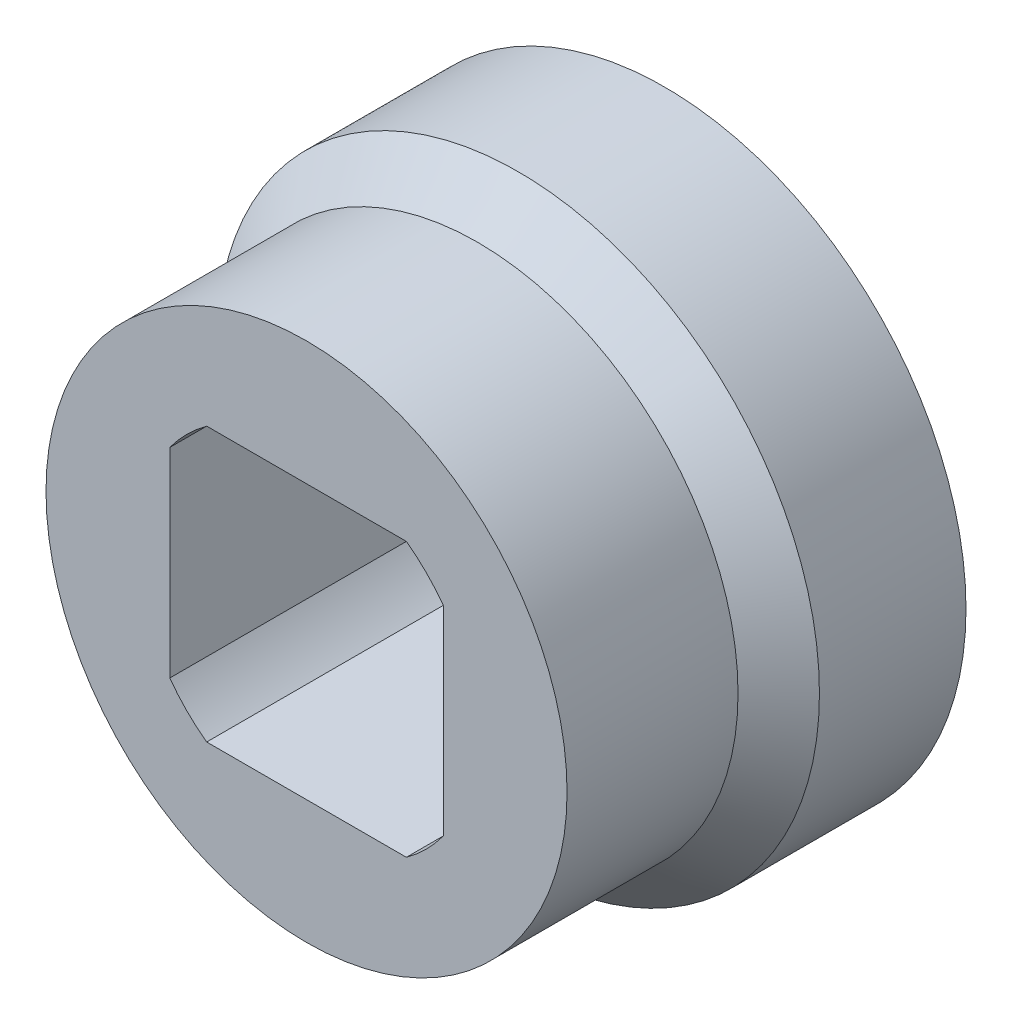
ISO-10303-21;
HEADER;
FILE_DESCRIPTION(('STEP AP214'),'2;1');
FILE_NAME('part.step','',(''),(''),'','','');
FILE_SCHEMA(('AUTOMOTIVE_DESIGN { 1 0 10303 214 1 1 1 1 }'));
ENDSEC;
DATA;
#1=APPLICATION_CONTEXT('core data for automotive mechanical design processes');
#2=APPLICATION_PROTOCOL_DEFINITION('international standard','automotive_design',2000,#1);
#3=PRODUCT_CONTEXT('',#1,'mechanical');
#4=PRODUCT('Part','Part','',(#3));
#5=PRODUCT_RELATED_PRODUCT_CATEGORY('part','',(#4));
#6=PRODUCT_DEFINITION_FORMATION('','',#4);
#7=PRODUCT_DEFINITION_CONTEXT('part definition',#1,'design');
#8=PRODUCT_DEFINITION('design','',#6,#7);
#9=PRODUCT_DEFINITION_SHAPE('','',#8);
#10=(LENGTH_UNIT() NAMED_UNIT(*) SI_UNIT(.MILLI.,.METRE.));
#11=(NAMED_UNIT(*) PLANE_ANGLE_UNIT() SI_UNIT($,.RADIAN.));
#12=(NAMED_UNIT(*) SI_UNIT($,.STERADIAN.) SOLID_ANGLE_UNIT());
#13=UNCERTAINTY_MEASURE_WITH_UNIT(LENGTH_MEASURE(1.E-05),#10,'distance_accuracy_value','');
#14=(GEOMETRIC_REPRESENTATION_CONTEXT(3) GLOBAL_UNCERTAINTY_ASSIGNED_CONTEXT((#13)) GLOBAL_UNIT_ASSIGNED_CONTEXT((#10,
#11,#12)) REPRESENTATION_CONTEXT('',''));
#15=CARTESIAN_POINT('',(0.,0.,0.));
#16=DIRECTION('',(0.,0.,1.));
#17=DIRECTION('',(1.,0.,0.));
#18=AXIS2_PLACEMENT_3D('',#15,#16,#17);
#19=CARTESIAN_POINT('',(0.,0.,-3.5));
#20=DIRECTION('',(0.,0.,-1.));
#21=DIRECTION('',(-1.,0.,0.));
#22=AXIS2_PLACEMENT_3D('',#19,#20,#21);
#23=CYLINDRICAL_SURFACE('',#22,15.9999999999999);
#24=CARTESIAN_POINT('',(0.,0.,-3.5));
#25=DIRECTION('',(0.,0.,-1.));
#26=DIRECTION('',(-1.,0.,0.));
#27=AXIS2_PLACEMENT_3D('',#24,#25,#26);
#28=CIRCLE('',#27,15.9999999999999);
#29=CARTESIAN_POINT('',(-15.9999999999999,0.,-3.5));
#30=VERTEX_POINT('',#29);
#31=EDGE_CURVE('E43',#30,#30,#28,.T.);
#32=ORIENTED_EDGE('',*,*,#31,.T.);
#33=EDGE_LOOP('',(#32));
#34=FACE_BOUND('',#33,.T.);
#35=CARTESIAN_POINT('',(0.,0.,-14.));
#36=DIRECTION('',(0.,0.,-1.));
#37=DIRECTION('',(-1.,0.,0.));
#38=AXIS2_PLACEMENT_3D('',#35,#36,#37);
#39=CIRCLE('',#38,15.9999999999999);
#40=CARTESIAN_POINT('',(-15.9999999999999,0.,-14.));
#41=VERTEX_POINT('',#40);
#42=EDGE_CURVE('E127',#41,#41,#39,.T.);
#43=ORIENTED_EDGE('',*,*,#42,.F.);
#44=EDGE_LOOP('',(#43));
#45=FACE_BOUND('',#44,.T.);
#46=ADVANCED_FACE('F36',(#34,#45),#23,.T.);
#47=CARTESIAN_POINT('',(16.,0.,-3.5));
#48=DIRECTION('',(0.,0.,1.));
#49=DIRECTION('',(1.,0.,0.));
#50=AXIS2_PLACEMENT_3D('',#47,#48,#49);
#51=PLANE('',#50);
#52=CARTESIAN_POINT('',(0.,0.,-3.5));
#53=DIRECTION('',(0.,0.,-1.));
#54=DIRECTION('',(-1.,0.,0.));
#55=AXIS2_PLACEMENT_3D('',#52,#53,#54);
#56=CIRCLE('',#55,10.4);
#57=CARTESIAN_POINT('',(-6.13188388670236,-8.4,-3.5));
#58=VERTEX_POINT('',#57);
#59=CARTESIAN_POINT('',(-8.4,-6.13188388670236,-3.5));
#60=VERTEX_POINT('',#59);
#61=EDGE_CURVE('E110',#58,#60,#56,.T.);
#62=ORIENTED_EDGE('',*,*,#61,.T.);
#63=DIRECTION('',(0.,1.,0.));
#64=VECTOR('',#63,1.);
#65=CARTESIAN_POINT('',(-8.4,-6.13188388670236,-3.5));
#66=LINE('',#65,#64);
#67=CARTESIAN_POINT('',(-8.4,6.13188388670236,-3.5));
#68=VERTEX_POINT('',#67);
#69=EDGE_CURVE('E115',#60,#68,#66,.T.);
#70=ORIENTED_EDGE('',*,*,#69,.T.);
#71=CARTESIAN_POINT('',(0.,0.,-3.5));
#72=DIRECTION('',(0.,0.,-1.));
#73=DIRECTION('',(-1.,0.,0.));
#74=AXIS2_PLACEMENT_3D('',#71,#72,#73);
#75=CIRCLE('',#74,10.4);
#76=CARTESIAN_POINT('',(-6.13188388670235,8.4,-3.5));
#77=VERTEX_POINT('',#76);
#78=EDGE_CURVE('E57',#68,#77,#75,.T.);
#79=ORIENTED_EDGE('',*,*,#78,.T.);
#80=DIRECTION('',(1.,0.,0.));
#81=VECTOR('',#80,1.);
#82=CARTESIAN_POINT('',(-6.13188388670235,8.4,-3.5));
#83=LINE('',#82,#81);
#84=CARTESIAN_POINT('',(6.13188388670236,8.4,-3.5));
#85=VERTEX_POINT('',#84);
#86=EDGE_CURVE('E277',#77,#85,#83,.T.);
#87=ORIENTED_EDGE('',*,*,#86,.T.);
#88=CARTESIAN_POINT('',(0.,0.,-3.5));
#89=DIRECTION('',(0.,0.,-1.));
#90=DIRECTION('',(-1.,0.,0.));
#91=AXIS2_PLACEMENT_3D('',#88,#89,#90);
#92=CIRCLE('',#91,10.4);
#93=CARTESIAN_POINT('',(8.4,6.13188388670235,-3.5));
#94=VERTEX_POINT('',#93);
#95=EDGE_CURVE('E280',#85,#94,#92,.T.);
#96=ORIENTED_EDGE('',*,*,#95,.T.);
#97=DIRECTION('',(0.,-1.,0.));
#98=VECTOR('',#97,1.);
#99=CARTESIAN_POINT('',(8.4,6.13188388670235,-3.5));
#100=LINE('',#99,#98);
#101=CARTESIAN_POINT('',(8.4,-6.13188388670236,-3.5));
#102=VERTEX_POINT('',#101);
#103=EDGE_CURVE('E283',#94,#102,#100,.T.);
#104=ORIENTED_EDGE('',*,*,#103,.T.);
#105=CARTESIAN_POINT('',(0.,0.,-3.5));
#106=DIRECTION('',(0.,0.,-1.));
#107=DIRECTION('',(-1.,0.,0.));
#108=AXIS2_PLACEMENT_3D('',#105,#106,#107);
#109=CIRCLE('',#108,10.4);
#110=CARTESIAN_POINT('',(6.13188388670236,-8.4,-3.5));
#111=VERTEX_POINT('',#110);
#112=EDGE_CURVE('E123',#102,#111,#109,.T.);
#113=ORIENTED_EDGE('',*,*,#112,.T.);
#114=DIRECTION('',(-1.,0.,0.));
#115=VECTOR('',#114,1.);
#116=CARTESIAN_POINT('',(6.13188388670236,-8.4,-3.5));
#117=LINE('',#116,#115);
#118=EDGE_CURVE('E118',#111,#58,#117,.T.);
#119=ORIENTED_EDGE('',*,*,#118,.T.);
#120=EDGE_LOOP('',(#62,#70,#79,#87,#96,#104,#113,#119));
#121=FACE_BOUND('',#120,.T.);
#122=ORIENTED_EDGE('',*,*,#31,.F.);
#123=EDGE_LOOP('',(#122));
#124=FACE_BOUND('',#123,.T.);
#125=ADVANCED_FACE('F140',(#121,#124),#51,.T.);
#126=CARTESIAN_POINT('',(0.,0.,-25.5));
#127=DIRECTION('',(0.,0.,-1.));
#128=DIRECTION('',(-1.,0.,0.));
#129=AXIS2_PLACEMENT_3D('',#126,#127,#128);
#130=PLANE('',#129);
#131=CARTESIAN_POINT('',(0.,0.,-25.5));
#132=DIRECTION('',(0.,0.,1.));
#133=DIRECTION('',(1.,0.,0.));
#134=AXIS2_PLACEMENT_3D('',#131,#132,#133);
#135=CIRCLE('',#134,16.3);
#136=CARTESIAN_POINT('',(16.3000000000001,0.,-25.5));
#137=VERTEX_POINT('',#136);
#138=EDGE_CURVE('E257',#137,#137,#135,.T.);
#139=ORIENTED_EDGE('',*,*,#138,.T.);
#140=EDGE_LOOP('',(#139));
#141=FACE_BOUND('',#140,.T.);
#142=CARTESIAN_POINT('',(0.,0.,-25.5));
#143=DIRECTION('',(0.,0.,-1.));
#144=DIRECTION('',(-1.,0.,0.));
#145=AXIS2_PLACEMENT_3D('',#142,#143,#144);
#146=CIRCLE('',#145,18.5);
#147=CARTESIAN_POINT('',(-18.4999999999999,0.,-25.5));
#148=VERTEX_POINT('',#147);
#149=EDGE_CURVE('E133',#148,#148,#146,.T.);
#150=ORIENTED_EDGE('',*,*,#149,.T.);
#151=EDGE_LOOP('',(#150));
#152=FACE_BOUND('',#151,.T.);
#153=ADVANCED_FACE('F142',(#141,#152),#130,.T.);
#154=CARTESIAN_POINT('',(0.,0.,-3.5));
#155=DIRECTION('',(0.,0.,-1.));
#156=DIRECTION('',(-1.,0.,0.));
#157=AXIS2_PLACEMENT_3D('',#154,#155,#156);
#158=CYLINDRICAL_SURFACE('',#157,18.5);
#159=CARTESIAN_POINT('',(0.,0.,-16.5));
#160=DIRECTION('',(0.,0.,-1.));
#161=DIRECTION('',(-1.,0.,0.));
#162=AXIS2_PLACEMENT_3D('',#159,#160,#161);
#163=CIRCLE('',#162,18.4999999999999);
#164=CARTESIAN_POINT('',(-18.4999999999999,0.,-16.5));
#165=VERTEX_POINT('',#164);
#166=EDGE_CURVE('E130',#165,#165,#163,.T.);
#167=ORIENTED_EDGE('',*,*,#166,.T.);
#168=EDGE_LOOP('',(#167));
#169=FACE_BOUND('',#168,.T.);
#170=ORIENTED_EDGE('',*,*,#149,.F.);
#171=EDGE_LOOP('',(#170));
#172=FACE_BOUND('',#171,.T.);
#173=ADVANCED_FACE('F148',(#169,#172),#158,.T.);
#174=CARTESIAN_POINT('',(0.,0.,-16.5));
#175=DIRECTION('',(0.,0.,-1.));
#176=DIRECTION('',(-1.,0.,0.));
#177=AXIS2_PLACEMENT_3D('',#174,#175,#176);
#178=CONICAL_SURFACE('',#177,18.4999999999999,0.785398163397447);
#179=ORIENTED_EDGE('',*,*,#42,.T.);
#180=EDGE_LOOP('',(#179));
#181=FACE_BOUND('',#180,.T.);
#182=ORIENTED_EDGE('',*,*,#166,.F.);
#183=EDGE_LOOP('',(#182));
#184=FACE_BOUND('',#183,.T.);
#185=ADVANCED_FACE('F154',(#181,#184),#178,.T.);
#186=CARTESIAN_POINT('',(0.,0.,-3.5));
#187=DIRECTION('',(0.,0.,-1.));
#188=DIRECTION('',(-1.,0.,0.));
#189=AXIS2_PLACEMENT_3D('',#186,#187,#188);
#190=CYLINDRICAL_SURFACE('',#189,10.4);
#191=DIRECTION('',(0.,0.,-1.));
#192=VECTOR('',#191,1.);
#193=CARTESIAN_POINT('',(-6.13188388670236,-8.4,-3.5));
#194=LINE('',#193,#192);
#195=CARTESIAN_POINT('',(-6.13188388670236,-8.4,-23.5));
#196=VERTEX_POINT('',#195);
#197=EDGE_CURVE('E109',#58,#196,#194,.T.);
#198=ORIENTED_EDGE('',*,*,#197,.T.);
#199=CARTESIAN_POINT('',(0.,0.,-23.5));
#200=DIRECTION('',(0.,0.,1.));
#201=DIRECTION('',(1.,0.,0.));
#202=AXIS2_PLACEMENT_3D('',#199,#200,#201);
#203=CIRCLE('',#202,10.4);
#204=CARTESIAN_POINT('',(-8.4,-6.13188388670236,-23.5));
#205=VERTEX_POINT('',#204);
#206=EDGE_CURVE('E99',#196,#205,#203,.F.);
#207=ORIENTED_EDGE('',*,*,#206,.T.);
#208=DIRECTION('',(0.,0.,-1.));
#209=VECTOR('',#208,1.);
#210=CARTESIAN_POINT('',(-8.4,-6.13188388670236,-3.5));
#211=LINE('',#210,#209);
#212=EDGE_CURVE('E107',#60,#205,#211,.T.);
#213=ORIENTED_EDGE('',*,*,#212,.F.);
#214=ORIENTED_EDGE('',*,*,#61,.F.);
#215=EDGE_LOOP('',(#198,#207,#213,#214));
#216=FACE_BOUND('',#215,.T.);
#217=ADVANCED_FACE('F105',(#216),#190,.F.);
#218=CARTESIAN_POINT('',(6.13188388670236,-8.4,-3.5));
#219=DIRECTION('',(0.,-1.,0.));
#220=DIRECTION('',(0.,0.,-1.));
#221=AXIS2_PLACEMENT_3D('',#218,#219,#220);
#222=PLANE('',#221);
#223=DIRECTION('',(0.,0.,-1.));
#224=VECTOR('',#223,1.);
#225=CARTESIAN_POINT('',(6.13188388670236,-8.4,-3.5));
#226=LINE('',#225,#224);
#227=CARTESIAN_POINT('',(6.13188388670236,-8.4,-23.5));
#228=VERTEX_POINT('',#227);
#229=EDGE_CURVE('E289',#111,#228,#226,.T.);
#230=ORIENTED_EDGE('',*,*,#229,.T.);
#231=DIRECTION('',(-1.,0.,0.));
#232=VECTOR('',#231,1.);
#233=CARTESIAN_POINT('',(6.13188388670236,-8.4,-23.5));
#234=LINE('',#233,#232);
#235=EDGE_CURVE('E111',#228,#196,#234,.T.);
#236=ORIENTED_EDGE('',*,*,#235,.T.);
#237=ORIENTED_EDGE('',*,*,#197,.F.);
#238=ORIENTED_EDGE('',*,*,#118,.F.);
#239=EDGE_LOOP('',(#230,#236,#237,#238));
#240=FACE_BOUND('',#239,.T.);
#241=ADVANCED_FACE('F161',(#240),#222,.F.);
#242=CARTESIAN_POINT('',(0.,0.,-3.5));
#243=DIRECTION('',(0.,0.,-1.));
#244=DIRECTION('',(-1.,0.,0.));
#245=AXIS2_PLACEMENT_3D('',#242,#243,#244);
#246=CYLINDRICAL_SURFACE('',#245,10.4);
#247=DIRECTION('',(0.,0.,-1.));
#248=VECTOR('',#247,1.);
#249=CARTESIAN_POINT('',(8.4,-6.13188388670236,-3.5));
#250=LINE('',#249,#248);
#251=CARTESIAN_POINT('',(8.4,-6.13188388670236,-23.5));
#252=VERTEX_POINT('',#251);
#253=EDGE_CURVE('E292',#102,#252,#250,.T.);
#254=ORIENTED_EDGE('',*,*,#253,.T.);
#255=CARTESIAN_POINT('',(0.,0.,-23.5));
#256=DIRECTION('',(0.,0.,1.));
#257=DIRECTION('',(1.,0.,0.));
#258=AXIS2_PLACEMENT_3D('',#255,#256,#257);
#259=CIRCLE('',#258,10.4);
#260=EDGE_CURVE('E270',#252,#228,#259,.F.);
#261=ORIENTED_EDGE('',*,*,#260,.T.);
#262=ORIENTED_EDGE('',*,*,#229,.F.);
#263=ORIENTED_EDGE('',*,*,#112,.F.);
#264=EDGE_LOOP('',(#254,#261,#262,#263));
#265=FACE_BOUND('',#264,.T.);
#266=ADVANCED_FACE('F178',(#265),#246,.F.);
#267=CARTESIAN_POINT('',(8.4,6.13188388670235,-3.5));
#268=DIRECTION('',(1.,0.,0.));
#269=DIRECTION('',(0.,1.,0.));
#270=AXIS2_PLACEMENT_3D('',#267,#268,#269);
#271=PLANE('',#270);
#272=DIRECTION('',(0.,0.,-1.));
#273=VECTOR('',#272,1.);
#274=CARTESIAN_POINT('',(8.4,6.13188388670235,-3.5));
#275=LINE('',#274,#273);
#276=CARTESIAN_POINT('',(8.4,6.13188388670235,-23.5));
#277=VERTEX_POINT('',#276);
#278=EDGE_CURVE('E295',#94,#277,#275,.T.);
#279=ORIENTED_EDGE('',*,*,#278,.T.);
#280=DIRECTION('',(0.,-1.,0.));
#281=VECTOR('',#280,1.);
#282=CARTESIAN_POINT('',(8.4,6.13188388670235,-23.5));
#283=LINE('',#282,#281);
#284=EDGE_CURVE('E267',#277,#252,#283,.T.);
#285=ORIENTED_EDGE('',*,*,#284,.T.);
#286=ORIENTED_EDGE('',*,*,#253,.F.);
#287=ORIENTED_EDGE('',*,*,#103,.F.);
#288=EDGE_LOOP('',(#279,#285,#286,#287));
#289=FACE_BOUND('',#288,.T.);
#290=ADVANCED_FACE('F174',(#289),#271,.F.);
#291=CARTESIAN_POINT('',(0.,0.,-3.5));
#292=DIRECTION('',(0.,0.,-1.));
#293=DIRECTION('',(-1.,0.,0.));
#294=AXIS2_PLACEMENT_3D('',#291,#292,#293);
#295=CYLINDRICAL_SURFACE('',#294,10.4);
#296=DIRECTION('',(0.,0.,-1.));
#297=VECTOR('',#296,1.);
#298=CARTESIAN_POINT('',(6.13188388670236,8.4,-3.5));
#299=LINE('',#298,#297);
#300=CARTESIAN_POINT('',(6.13188388670236,8.4,-23.5));
#301=VERTEX_POINT('',#300);
#302=EDGE_CURVE('E298',#85,#301,#299,.T.);
#303=ORIENTED_EDGE('',*,*,#302,.T.);
#304=CARTESIAN_POINT('',(0.,0.,-23.5));
#305=DIRECTION('',(0.,0.,1.));
#306=DIRECTION('',(1.,0.,0.));
#307=AXIS2_PLACEMENT_3D('',#304,#305,#306);
#308=CIRCLE('',#307,10.4);
#309=EDGE_CURVE('E264',#301,#277,#308,.F.);
#310=ORIENTED_EDGE('',*,*,#309,.T.);
#311=ORIENTED_EDGE('',*,*,#278,.F.);
#312=ORIENTED_EDGE('',*,*,#95,.F.);
#313=EDGE_LOOP('',(#303,#310,#311,#312));
#314=FACE_BOUND('',#313,.T.);
#315=ADVANCED_FACE('F170',(#314),#295,.F.);
#316=CARTESIAN_POINT('',(-6.13188388670235,8.4,-3.5));
#317=DIRECTION('',(0.,1.,0.));
#318=DIRECTION('',(-1.,0.,0.));
#319=AXIS2_PLACEMENT_3D('',#316,#317,#318);
#320=PLANE('',#319);
#321=DIRECTION('',(0.,0.,-1.));
#322=VECTOR('',#321,1.);
#323=CARTESIAN_POINT('',(-6.13188388670235,8.4,-3.5));
#324=LINE('',#323,#322);
#325=CARTESIAN_POINT('',(-6.13188388670235,8.4,-23.5));
#326=VERTEX_POINT('',#325);
#327=EDGE_CURVE('E120',#77,#326,#324,.T.);
#328=ORIENTED_EDGE('',*,*,#327,.T.);
#329=DIRECTION('',(1.,0.,0.));
#330=VECTOR('',#329,1.);
#331=CARTESIAN_POINT('',(-6.13188388670235,8.4,-23.5));
#332=LINE('',#331,#330);
#333=EDGE_CURVE('E261',#326,#301,#332,.T.);
#334=ORIENTED_EDGE('',*,*,#333,.T.);
#335=ORIENTED_EDGE('',*,*,#302,.F.);
#336=ORIENTED_EDGE('',*,*,#86,.F.);
#337=EDGE_LOOP('',(#328,#334,#335,#336));
#338=FACE_BOUND('',#337,.T.);
#339=ADVANCED_FACE('F167',(#338),#320,.F.);
#340=CARTESIAN_POINT('',(0.,0.,-3.5));
#341=DIRECTION('',(0.,0.,-1.));
#342=DIRECTION('',(-1.,0.,0.));
#343=AXIS2_PLACEMENT_3D('',#340,#341,#342);
#344=CYLINDRICAL_SURFACE('',#343,10.4);
#345=DIRECTION('',(0.,0.,-1.));
#346=VECTOR('',#345,1.);
#347=CARTESIAN_POINT('',(-8.4,6.13188388670236,-3.5));
#348=LINE('',#347,#346);
#349=CARTESIAN_POINT('',(-8.4,6.13188388670236,-23.5));
#350=VERTEX_POINT('',#349);
#351=EDGE_CURVE('E117',#68,#350,#348,.T.);
#352=ORIENTED_EDGE('',*,*,#351,.T.);
#353=CARTESIAN_POINT('',(0.,0.,-23.5));
#354=DIRECTION('',(0.,0.,1.));
#355=DIRECTION('',(1.,0.,0.));
#356=AXIS2_PLACEMENT_3D('',#353,#354,#355);
#357=CIRCLE('',#356,10.4);
#358=EDGE_CURVE('E50',#350,#326,#357,.F.);
#359=ORIENTED_EDGE('',*,*,#358,.T.);
#360=ORIENTED_EDGE('',*,*,#327,.F.);
#361=ORIENTED_EDGE('',*,*,#78,.F.);
#362=EDGE_LOOP('',(#352,#359,#360,#361));
#363=FACE_BOUND('',#362,.T.);
#364=ADVANCED_FACE('F164',(#363),#344,.F.);
#365=CARTESIAN_POINT('',(-8.4,-6.13188388670236,-3.5));
#366=DIRECTION('',(-1.,0.,0.));
#367=DIRECTION('',(0.,-1.,0.));
#368=AXIS2_PLACEMENT_3D('',#365,#366,#367);
#369=PLANE('',#368);
#370=ORIENTED_EDGE('',*,*,#212,.T.);
#371=DIRECTION('',(0.,1.,0.));
#372=VECTOR('',#371,1.);
#373=CARTESIAN_POINT('',(-8.4,-6.13188388670236,-23.5));
#374=LINE('',#373,#372);
#375=EDGE_CURVE('E11',#205,#350,#374,.T.);
#376=ORIENTED_EDGE('',*,*,#375,.T.);
#377=ORIENTED_EDGE('',*,*,#351,.F.);
#378=ORIENTED_EDGE('',*,*,#69,.F.);
#379=EDGE_LOOP('',(#370,#376,#377,#378));
#380=FACE_BOUND('',#379,.T.);
#381=ADVANCED_FACE('F113',(#380),#369,.F.);
#382=CARTESIAN_POINT('',(0.,0.,-23.5));
#383=DIRECTION('',(0.,0.,1.));
#384=DIRECTION('',(1.,0.,0.));
#385=AXIS2_PLACEMENT_3D('',#382,#383,#384);
#386=PLANE('',#385);
#387=CARTESIAN_POINT('',(12.,0.,-23.5));
#388=DIRECTION('',(0.,0.,-1.));
#389=DIRECTION('',(-1.,0.,0.));
#390=AXIS2_PLACEMENT_3D('',#387,#388,#389);
#391=CIRCLE('',#390,2.00000002980231);
#392=CARTESIAN_POINT('',(9.99999997019769,0.,-23.5));
#393=VERTEX_POINT('',#392);
#394=EDGE_CURVE('E232',#393,#393,#391,.T.);
#395=ORIENTED_EDGE('',*,*,#394,.F.);
#396=EDGE_LOOP('',(#395));
#397=FACE_BOUND('',#396,.T.);
#398=CARTESIAN_POINT('',(0.,-12.,-23.5));
#399=DIRECTION('',(0.,0.,-1.));
#400=DIRECTION('',(-1.,0.,0.));
#401=AXIS2_PLACEMENT_3D('',#398,#399,#400);
#402=CIRCLE('',#401,2.00000002980231);
#403=CARTESIAN_POINT('',(-2.00000002980231,-12.,-23.5));
#404=VERTEX_POINT('',#403);
#405=EDGE_CURVE('E234',#404,#404,#402,.T.);
#406=ORIENTED_EDGE('',*,*,#405,.F.);
#407=EDGE_LOOP('',(#406));
#408=FACE_BOUND('',#407,.T.);
#409=CARTESIAN_POINT('',(-12.,0.,-23.5));
#410=DIRECTION('',(0.,0.,-1.));
#411=DIRECTION('',(-1.,0.,0.));
#412=AXIS2_PLACEMENT_3D('',#409,#410,#411);
#413=CIRCLE('',#412,2.00000002980231);
#414=CARTESIAN_POINT('',(-14.0000000298023,0.,-23.5));
#415=VERTEX_POINT('',#414);
#416=EDGE_CURVE('E242',#415,#415,#413,.T.);
#417=ORIENTED_EDGE('',*,*,#416,.F.);
#418=EDGE_LOOP('',(#417));
#419=FACE_BOUND('',#418,.T.);
#420=CARTESIAN_POINT('',(0.,12.,-23.5));
#421=DIRECTION('',(0.,0.,-1.));
#422=DIRECTION('',(-1.,0.,0.));
#423=AXIS2_PLACEMENT_3D('',#420,#421,#422);
#424=CIRCLE('',#423,2.00000002980231);
#425=CARTESIAN_POINT('',(-2.00000002980231,12.,-23.5));
#426=VERTEX_POINT('',#425);
#427=EDGE_CURVE('E248',#426,#426,#424,.T.);
#428=ORIENTED_EDGE('',*,*,#427,.F.);
#429=EDGE_LOOP('',(#428));
#430=FACE_BOUND('',#429,.T.);
#431=CARTESIAN_POINT('',(0.,0.,-23.5));
#432=DIRECTION('',(0.,0.,1.));
#433=DIRECTION('',(1.,0.,0.));
#434=AXIS2_PLACEMENT_3D('',#431,#432,#433);
#435=CIRCLE('',#434,16.3);
#436=CARTESIAN_POINT('',(16.3000000000001,0.,-23.5));
#437=VERTEX_POINT('',#436);
#438=EDGE_CURVE('E254',#437,#437,#435,.T.);
#439=ORIENTED_EDGE('',*,*,#438,.F.);
#440=EDGE_LOOP('',(#439));
#441=FACE_BOUND('',#440,.T.);
#442=ORIENTED_EDGE('',*,*,#235,.F.);
#443=ORIENTED_EDGE('',*,*,#260,.F.);
#444=ORIENTED_EDGE('',*,*,#284,.F.);
#445=ORIENTED_EDGE('',*,*,#309,.F.);
#446=ORIENTED_EDGE('',*,*,#333,.F.);
#447=ORIENTED_EDGE('',*,*,#358,.F.);
#448=ORIENTED_EDGE('',*,*,#375,.F.);
#449=ORIENTED_EDGE('',*,*,#206,.F.);
#450=EDGE_LOOP('',(#442,#443,#444,#445,#446,#447,#448,#449));
#451=FACE_BOUND('',#450,.T.);
#452=ADVANCED_FACE('F98',(#397,#408,#419,#430,#441,#451),#386,.F.);
#453=CARTESIAN_POINT('',(0.,0.,-25.5));
#454=DIRECTION('',(0.,0.,1.));
#455=DIRECTION('',(1.,0.,0.));
#456=AXIS2_PLACEMENT_3D('',#453,#454,#455);
#457=CYLINDRICAL_SURFACE('',#456,16.3);
#458=ORIENTED_EDGE('',*,*,#138,.F.);
#459=EDGE_LOOP('',(#458));
#460=FACE_BOUND('',#459,.T.);
#461=ORIENTED_EDGE('',*,*,#438,.T.);
#462=EDGE_LOOP('',(#461));
#463=FACE_BOUND('',#462,.T.);
#464=ADVANCED_FACE('F186',(#460,#463),#457,.F.);
#465=CARTESIAN_POINT('',(0.,12.,-15.5));
#466=DIRECTION('',(0.,0.,1.));
#467=DIRECTION('',(1.,0.,0.));
#468=AXIS2_PLACEMENT_3D('',#465,#466,#467);
#469=PLANE('',#468);
#470=CARTESIAN_POINT('',(0.,12.,-15.5));
#471=DIRECTION('',(0.,0.,-1.));
#472=DIRECTION('',(-1.,0.,0.));
#473=AXIS2_PLACEMENT_3D('',#470,#471,#472);
#474=CIRCLE('',#473,2.00000002980231);
#475=CARTESIAN_POINT('',(-2.00000002980231,12.,-15.5));
#476=VERTEX_POINT('',#475);
#477=EDGE_CURVE('E251',#476,#476,#474,.T.);
#478=ORIENTED_EDGE('',*,*,#477,.T.);
#479=EDGE_LOOP('',(#478));
#480=FACE_BOUND('',#479,.T.);
#481=ADVANCED_FACE('F189',(#480),#469,.F.);
#482=CARTESIAN_POINT('',(0.,12.,-23.5));
#483=DIRECTION('',(0.,0.,-1.));
#484=DIRECTION('',(-1.,0.,0.));
#485=AXIS2_PLACEMENT_3D('',#482,#483,#484);
#486=CYLINDRICAL_SURFACE('',#485,2.00000002980231);
#487=ORIENTED_EDGE('',*,*,#477,.F.);
#488=EDGE_LOOP('',(#487));
#489=FACE_BOUND('',#488,.T.);
#490=ORIENTED_EDGE('',*,*,#427,.T.);
#491=EDGE_LOOP('',(#490));
#492=FACE_BOUND('',#491,.T.);
#493=ADVANCED_FACE('F196',(#489,#492),#486,.F.);
#494=CARTESIAN_POINT('',(-12.,0.,-15.5));
#495=DIRECTION('',(0.,0.,1.));
#496=DIRECTION('',(1.,0.,0.));
#497=AXIS2_PLACEMENT_3D('',#494,#495,#496);
#498=PLANE('',#497);
#499=CARTESIAN_POINT('',(-12.,0.,-15.5));
#500=DIRECTION('',(0.,0.,-1.));
#501=DIRECTION('',(-1.,0.,0.));
#502=AXIS2_PLACEMENT_3D('',#499,#500,#501);
#503=CIRCLE('',#502,2.00000002980231);
#504=CARTESIAN_POINT('',(-14.0000000298023,0.,-15.5));
#505=VERTEX_POINT('',#504);
#506=EDGE_CURVE('E245',#505,#505,#503,.T.);
#507=ORIENTED_EDGE('',*,*,#506,.T.);
#508=EDGE_LOOP('',(#507));
#509=FACE_BOUND('',#508,.T.);
#510=ADVANCED_FACE('F200',(#509),#498,.F.);
#511=CARTESIAN_POINT('',(-12.,0.,-23.5));
#512=DIRECTION('',(0.,0.,-1.));
#513=DIRECTION('',(-1.,0.,0.));
#514=AXIS2_PLACEMENT_3D('',#511,#512,#513);
#515=CYLINDRICAL_SURFACE('',#514,2.00000002980231);
#516=ORIENTED_EDGE('',*,*,#506,.F.);
#517=EDGE_LOOP('',(#516));
#518=FACE_BOUND('',#517,.T.);
#519=ORIENTED_EDGE('',*,*,#416,.T.);
#520=EDGE_LOOP('',(#519));
#521=FACE_BOUND('',#520,.T.);
#522=ADVANCED_FACE('F204',(#518,#521),#515,.F.);
#523=CARTESIAN_POINT('',(0.,-12.,-15.5));
#524=DIRECTION('',(0.,0.,1.));
#525=DIRECTION('',(1.,0.,0.));
#526=AXIS2_PLACEMENT_3D('',#523,#524,#525);
#527=PLANE('',#526);
#528=CARTESIAN_POINT('',(0.,-12.,-15.5));
#529=DIRECTION('',(0.,0.,-1.));
#530=DIRECTION('',(-1.,0.,0.));
#531=AXIS2_PLACEMENT_3D('',#528,#529,#530);
#532=CIRCLE('',#531,2.00000002980231);
#533=CARTESIAN_POINT('',(-2.00000002980231,-12.,-15.5));
#534=VERTEX_POINT('',#533);
#535=EDGE_CURVE('E239',#534,#534,#532,.T.);
#536=ORIENTED_EDGE('',*,*,#535,.T.);
#537=EDGE_LOOP('',(#536));
#538=FACE_BOUND('',#537,.T.);
#539=ADVANCED_FACE('F208',(#538),#527,.F.);
#540=CARTESIAN_POINT('',(0.,-12.,-23.5));
#541=DIRECTION('',(0.,0.,-1.));
#542=DIRECTION('',(-1.,0.,0.));
#543=AXIS2_PLACEMENT_3D('',#540,#541,#542);
#544=CYLINDRICAL_SURFACE('',#543,2.00000002980231);
#545=ORIENTED_EDGE('',*,*,#535,.F.);
#546=EDGE_LOOP('',(#545));
#547=FACE_BOUND('',#546,.T.);
#548=ORIENTED_EDGE('',*,*,#405,.T.);
#549=EDGE_LOOP('',(#548));
#550=FACE_BOUND('',#549,.T.);
#551=ADVANCED_FACE('F212',(#547,#550),#544,.F.);
#552=CARTESIAN_POINT('',(12.,0.,-15.5));
#553=DIRECTION('',(0.,0.,1.));
#554=DIRECTION('',(1.,0.,0.));
#555=AXIS2_PLACEMENT_3D('',#552,#553,#554);
#556=PLANE('',#555);
#557=CARTESIAN_POINT('',(12.,0.,-15.5));
#558=DIRECTION('',(0.,0.,-1.));
#559=DIRECTION('',(-1.,0.,0.));
#560=AXIS2_PLACEMENT_3D('',#557,#558,#559);
#561=CIRCLE('',#560,2.00000002980231);
#562=CARTESIAN_POINT('',(9.99999997019769,0.,-15.5));
#563=VERTEX_POINT('',#562);
#564=EDGE_CURVE('E229',#563,#563,#561,.T.);
#565=ORIENTED_EDGE('',*,*,#564,.T.);
#566=EDGE_LOOP('',(#565));
#567=FACE_BOUND('',#566,.T.);
#568=ADVANCED_FACE('F216',(#567),#556,.F.);
#569=CARTESIAN_POINT('',(12.,0.,-23.5));
#570=DIRECTION('',(0.,0.,-1.));
#571=DIRECTION('',(-1.,0.,0.));
#572=AXIS2_PLACEMENT_3D('',#569,#570,#571);
#573=CYLINDRICAL_SURFACE('',#572,2.00000002980231);
#574=ORIENTED_EDGE('',*,*,#564,.F.);
#575=EDGE_LOOP('',(#574));
#576=FACE_BOUND('',#575,.T.);
#577=ORIENTED_EDGE('',*,*,#394,.T.);
#578=EDGE_LOOP('',(#577));
#579=FACE_BOUND('',#578,.T.);
#580=ADVANCED_FACE('F220',(#576,#579),#573,.F.);
#581=CLOSED_SHELL('',(#46,#125,#153,#173,#185,#217,#241,#266,#290,#315,#339,#364,#381,#452,#464,
#481,#493,#510,#522,#539,#551,#568,#580));
#582=MANIFOLD_SOLID_BREP('B2',#581);
#583=ADVANCED_BREP_SHAPE_REPRESENTATION('',(#18,#582),#14);
#584=SHAPE_DEFINITION_REPRESENTATION(#9,#583);
ENDSEC;
END-ISO-10303-21;
